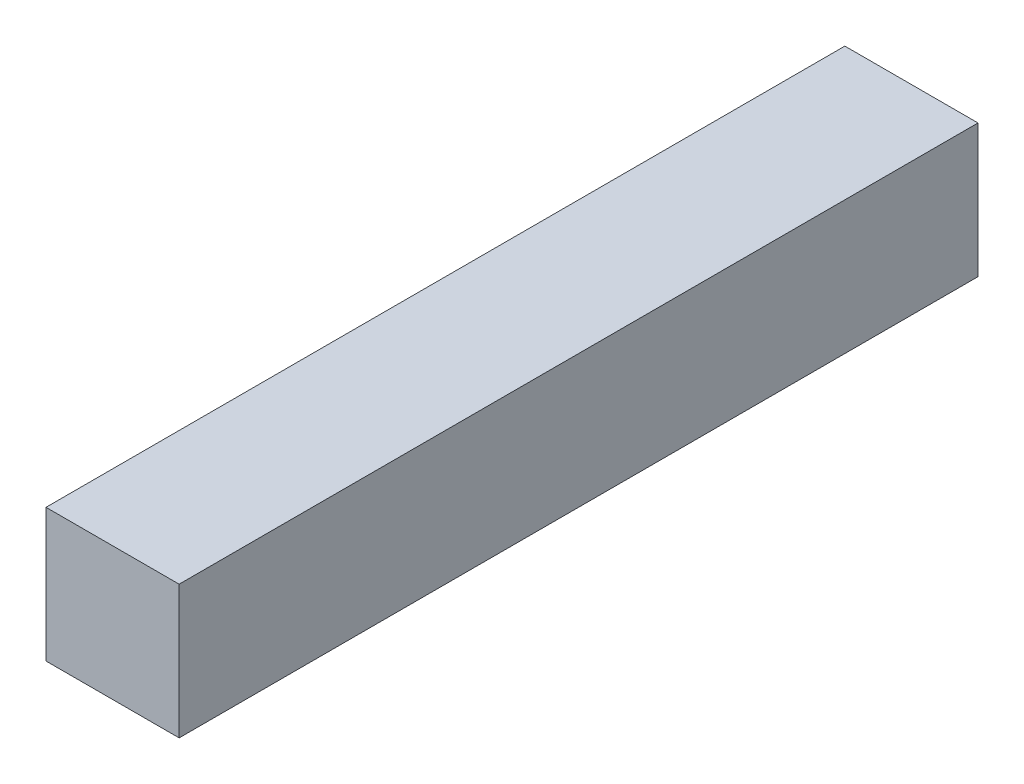
ISO-10303-21;
HEADER;
FILE_DESCRIPTION(('STEP AP214'),'2;1');
FILE_NAME('part.step','',(''),(''),'','','');
FILE_SCHEMA(('AUTOMOTIVE_DESIGN { 1 0 10303 214 1 1 1 1 }'));
ENDSEC;
DATA;
#1=APPLICATION_CONTEXT('core data for automotive mechanical design processes');
#2=APPLICATION_PROTOCOL_DEFINITION('international standard','automotive_design',2000,#1);
#3=PRODUCT_CONTEXT('',#1,'mechanical');
#4=PRODUCT('Part','Part','',(#3));
#5=PRODUCT_RELATED_PRODUCT_CATEGORY('part','',(#4));
#6=PRODUCT_DEFINITION_FORMATION('','',#4);
#7=PRODUCT_DEFINITION_CONTEXT('part definition',#1,'design');
#8=PRODUCT_DEFINITION('design','',#6,#7);
#9=PRODUCT_DEFINITION_SHAPE('','',#8);
#10=(LENGTH_UNIT() NAMED_UNIT(*) SI_UNIT(.MILLI.,.METRE.));
#11=(NAMED_UNIT(*) PLANE_ANGLE_UNIT() SI_UNIT($,.RADIAN.));
#12=(NAMED_UNIT(*) SI_UNIT($,.STERADIAN.) SOLID_ANGLE_UNIT());
#13=UNCERTAINTY_MEASURE_WITH_UNIT(LENGTH_MEASURE(1.E-05),#10,'distance_accuracy_value','');
#14=(GEOMETRIC_REPRESENTATION_CONTEXT(3) GLOBAL_UNCERTAINTY_ASSIGNED_CONTEXT((#13)) GLOBAL_UNIT_ASSIGNED_CONTEXT((#10,
#11,#12)) REPRESENTATION_CONTEXT('',''));
#15=CARTESIAN_POINT('',(0.,0.,0.));
#16=DIRECTION('',(0.,0.,1.));
#17=DIRECTION('',(1.,0.,0.));
#18=AXIS2_PLACEMENT_3D('',#15,#16,#17);
#19=CARTESIAN_POINT('',(5.,-5.,60.));
#20=DIRECTION('',(-1.,0.,0.));
#21=DIRECTION('',(0.,0.,1.));
#22=AXIS2_PLACEMENT_3D('',#19,#20,#21);
#23=PLANE('',#22);
#24=DIRECTION('',(0.,1.,0.));
#25=VECTOR('',#24,1.);
#26=CARTESIAN_POINT('',(5.,-5.,0.));
#27=LINE('',#26,#25);
#28=CARTESIAN_POINT('',(5.,-5.,0.));
#29=VERTEX_POINT('',#28);
#30=CARTESIAN_POINT('',(5.,5.,0.));
#31=VERTEX_POINT('',#30);
#32=EDGE_CURVE('E100',#29,#31,#27,.T.);
#33=ORIENTED_EDGE('',*,*,#32,.T.);
#34=DIRECTION('',(0.,0.,-1.));
#35=VECTOR('',#34,1.);
#36=CARTESIAN_POINT('',(5.,5.,60.));
#37=LINE('',#36,#35);
#38=CARTESIAN_POINT('',(5.,5.,60.));
#39=VERTEX_POINT('',#38);
#40=EDGE_CURVE('E11',#39,#31,#37,.T.);
#41=ORIENTED_EDGE('',*,*,#40,.F.);
#42=DIRECTION('',(0.,1.,0.));
#43=VECTOR('',#42,1.);
#44=CARTESIAN_POINT('',(5.,-5.,60.));
#45=LINE('',#44,#43);
#46=CARTESIAN_POINT('',(5.,-5.,60.));
#47=VERTEX_POINT('',#46);
#48=EDGE_CURVE('E88',#47,#39,#45,.T.);
#49=ORIENTED_EDGE('',*,*,#48,.F.);
#50=DIRECTION('',(0.,0.,-1.));
#51=VECTOR('',#50,1.);
#52=CARTESIAN_POINT('',(5.,-5.,60.));
#53=LINE('',#52,#51);
#54=EDGE_CURVE('E96',#47,#29,#53,.T.);
#55=ORIENTED_EDGE('',*,*,#54,.T.);
#56=EDGE_LOOP('',(#33,#41,#49,#55));
#57=FACE_BOUND('',#56,.T.);
#58=ADVANCED_FACE('F37',(#57),#23,.F.);
#59=CARTESIAN_POINT('',(-5.,5.,60.));
#60=DIRECTION('',(0.,-1.,0.));
#61=DIRECTION('',(0.,0.,-1.));
#62=AXIS2_PLACEMENT_3D('',#59,#60,#61);
#63=PLANE('',#62);
#64=DIRECTION('',(-1.,0.,0.));
#65=VECTOR('',#64,1.);
#66=CARTESIAN_POINT('',(-5.,5.,0.));
#67=LINE('',#66,#65);
#68=CARTESIAN_POINT('',(-5.,5.,0.));
#69=VERTEX_POINT('',#68);
#70=EDGE_CURVE('E92',#31,#69,#67,.T.);
#71=ORIENTED_EDGE('',*,*,#70,.T.);
#72=DIRECTION('',(0.,0.,-1.));
#73=VECTOR('',#72,1.);
#74=CARTESIAN_POINT('',(-5.,5.,60.));
#75=LINE('',#74,#73);
#76=CARTESIAN_POINT('',(-5.,5.,60.));
#77=VERTEX_POINT('',#76);
#78=EDGE_CURVE('E45',#77,#69,#75,.T.);
#79=ORIENTED_EDGE('',*,*,#78,.F.);
#80=DIRECTION('',(-1.,0.,0.));
#81=VECTOR('',#80,1.);
#82=CARTESIAN_POINT('',(-5.,5.,60.));
#83=LINE('',#82,#81);
#84=EDGE_CURVE('E83',#39,#77,#83,.T.);
#85=ORIENTED_EDGE('',*,*,#84,.F.);
#86=ORIENTED_EDGE('',*,*,#40,.T.);
#87=EDGE_LOOP('',(#71,#79,#85,#86));
#88=FACE_BOUND('',#87,.T.);
#89=ADVANCED_FACE('F91',(#88),#63,.F.);
#90=CARTESIAN_POINT('',(-5.,-5.,60.));
#91=DIRECTION('',(1.,0.,0.));
#92=DIRECTION('',(0.,0.,-1.));
#93=AXIS2_PLACEMENT_3D('',#90,#91,#92);
#94=PLANE('',#93);
#95=DIRECTION('',(0.,-1.,0.));
#96=VECTOR('',#95,1.);
#97=CARTESIAN_POINT('',(-5.,-5.,0.));
#98=LINE('',#97,#96);
#99=CARTESIAN_POINT('',(-5.,-5.,0.));
#100=VERTEX_POINT('',#99);
#101=EDGE_CURVE('E70',#69,#100,#98,.T.);
#102=ORIENTED_EDGE('',*,*,#101,.T.);
#103=DIRECTION('',(0.,0.,-1.));
#104=VECTOR('',#103,1.);
#105=CARTESIAN_POINT('',(-5.,-5.,60.));
#106=LINE('',#105,#104);
#107=CARTESIAN_POINT('',(-5.,-5.,60.));
#108=VERTEX_POINT('',#107);
#109=EDGE_CURVE('E93',#108,#100,#106,.T.);
#110=ORIENTED_EDGE('',*,*,#109,.F.);
#111=DIRECTION('',(0.,-1.,0.));
#112=VECTOR('',#111,1.);
#113=CARTESIAN_POINT('',(-5.,-5.,60.));
#114=LINE('',#113,#112);
#115=EDGE_CURVE('E86',#77,#108,#114,.T.);
#116=ORIENTED_EDGE('',*,*,#115,.F.);
#117=ORIENTED_EDGE('',*,*,#78,.T.);
#118=EDGE_LOOP('',(#102,#110,#116,#117));
#119=FACE_BOUND('',#118,.T.);
#120=ADVANCED_FACE('F94',(#119),#94,.F.);
#121=CARTESIAN_POINT('',(-5.,-5.,60.));
#122=DIRECTION('',(0.,1.,0.));
#123=DIRECTION('',(-1.,0.,0.));
#124=AXIS2_PLACEMENT_3D('',#121,#122,#123);
#125=PLANE('',#124);
#126=DIRECTION('',(1.,0.,0.));
#127=VECTOR('',#126,1.);
#128=CARTESIAN_POINT('',(-5.,-5.,0.));
#129=LINE('',#128,#127);
#130=EDGE_CURVE('E76',#100,#29,#129,.T.);
#131=ORIENTED_EDGE('',*,*,#130,.T.);
#132=ORIENTED_EDGE('',*,*,#54,.F.);
#133=DIRECTION('',(1.,0.,0.));
#134=VECTOR('',#133,1.);
#135=CARTESIAN_POINT('',(-5.,-5.,60.));
#136=LINE('',#135,#134);
#137=EDGE_CURVE('E53',#108,#47,#136,.T.);
#138=ORIENTED_EDGE('',*,*,#137,.F.);
#139=ORIENTED_EDGE('',*,*,#109,.T.);
#140=EDGE_LOOP('',(#131,#132,#138,#139));
#141=FACE_BOUND('',#140,.T.);
#142=ADVANCED_FACE('F107',(#141),#125,.F.);
#143=CARTESIAN_POINT('',(0.,0.,60.));
#144=DIRECTION('',(0.,0.,-1.));
#145=DIRECTION('',(-1.,0.,0.));
#146=AXIS2_PLACEMENT_3D('',#143,#144,#145);
#147=PLANE('',#146);
#148=ORIENTED_EDGE('',*,*,#48,.T.);
#149=ORIENTED_EDGE('',*,*,#84,.T.);
#150=ORIENTED_EDGE('',*,*,#115,.T.);
#151=ORIENTED_EDGE('',*,*,#137,.T.);
#152=EDGE_LOOP('',(#148,#149,#150,#151));
#153=FACE_BOUND('',#152,.T.);
#154=ADVANCED_FACE('F84',(#153),#147,.F.);
#155=CARTESIAN_POINT('',(0.,0.,0.));
#156=DIRECTION('',(0.,0.,-1.));
#157=DIRECTION('',(-1.,0.,0.));
#158=AXIS2_PLACEMENT_3D('',#155,#156,#157);
#159=PLANE('',#158);
#160=ORIENTED_EDGE('',*,*,#32,.F.);
#161=ORIENTED_EDGE('',*,*,#130,.F.);
#162=ORIENTED_EDGE('',*,*,#101,.F.);
#163=ORIENTED_EDGE('',*,*,#70,.F.);
#164=EDGE_LOOP('',(#160,#161,#162,#163));
#165=FACE_BOUND('',#164,.T.);
#166=ADVANCED_FACE('F110',(#165),#159,.T.);
#167=CLOSED_SHELL('',(#58,#89,#120,#142,#154,#166));
#168=MANIFOLD_SOLID_BREP('B2',#167);
#169=ADVANCED_BREP_SHAPE_REPRESENTATION('',(#18,#168),#14);
#170=SHAPE_DEFINITION_REPRESENTATION(#9,#169);
ENDSEC;
END-ISO-10303-21;
